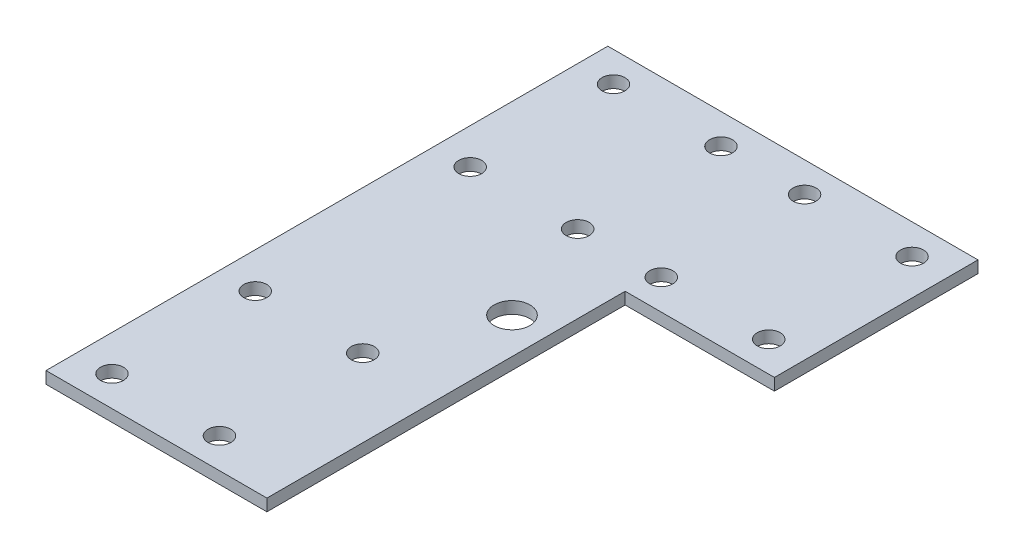
ISO-10303-21;
HEADER;
FILE_DESCRIPTION(('STEP AP214'),'2;1');
FILE_NAME('part.step','',(''),(''),'','','');
FILE_SCHEMA(('AUTOMOTIVE_DESIGN { 1 0 10303 214 1 1 1 1 }'));
ENDSEC;
DATA;
#1=APPLICATION_CONTEXT('core data for automotive mechanical design processes');
#2=APPLICATION_PROTOCOL_DEFINITION('international standard','automotive_design',2000,#1);
#3=PRODUCT_CONTEXT('',#1,'mechanical');
#4=PRODUCT('Part','Part','',(#3));
#5=PRODUCT_RELATED_PRODUCT_CATEGORY('part','',(#4));
#6=PRODUCT_DEFINITION_FORMATION('','',#4);
#7=PRODUCT_DEFINITION_CONTEXT('part definition',#1,'design');
#8=PRODUCT_DEFINITION('design','',#6,#7);
#9=PRODUCT_DEFINITION_SHAPE('','',#8);
#10=(LENGTH_UNIT() NAMED_UNIT(*) SI_UNIT(.MILLI.,.METRE.));
#11=(NAMED_UNIT(*) PLANE_ANGLE_UNIT() SI_UNIT($,.RADIAN.));
#12=(NAMED_UNIT(*) SI_UNIT($,.STERADIAN.) SOLID_ANGLE_UNIT());
#13=UNCERTAINTY_MEASURE_WITH_UNIT(LENGTH_MEASURE(1.E-05),#10,'distance_accuracy_value','');
#14=(GEOMETRIC_REPRESENTATION_CONTEXT(3) GLOBAL_UNCERTAINTY_ASSIGNED_CONTEXT((#13)) GLOBAL_UNIT_ASSIGNED_CONTEXT((#10,
#11,#12)) REPRESENTATION_CONTEXT('',''));
#15=CARTESIAN_POINT('',(0.,0.,0.));
#16=DIRECTION('',(0.,0.,1.));
#17=DIRECTION('',(1.,0.,0.));
#18=AXIS2_PLACEMENT_3D('',#15,#16,#17);
#19=CARTESIAN_POINT('',(0.,2.,0.));
#20=DIRECTION('',(0.,1.,0.));
#21=DIRECTION('',(0.,0.,1.));
#22=AXIS2_PLACEMENT_3D('',#19,#20,#21);
#23=PLANE('',#22);
#24=DIRECTION('',(0.,0.,1.));
#25=VECTOR('',#24,1.);
#26=CARTESIAN_POINT('',(-25.,2.,-60.));
#27=LINE('',#26,#25);
#28=CARTESIAN_POINT('',(-25.,2.,-60.));
#29=VERTEX_POINT('',#28);
#30=CARTESIAN_POINT('',(-25.,2.,0.));
#31=VERTEX_POINT('',#30);
#32=EDGE_CURVE('E55',#29,#31,#27,.T.);
#33=ORIENTED_EDGE('',*,*,#32,.F.);
#34=DIRECTION('',(-1.,0.,0.));
#35=VECTOR('',#34,1.);
#36=CARTESIAN_POINT('',(0.,2.,-60.));
#37=LINE('',#36,#35);
#38=CARTESIAN_POINT('',(0.,2.,-60.));
#39=VERTEX_POINT('',#38);
#40=EDGE_CURVE('E267',#39,#29,#37,.T.);
#41=ORIENTED_EDGE('',*,*,#40,.F.);
#42=DIRECTION('',(0.,0.,-1.));
#43=VECTOR('',#42,1.);
#44=CARTESIAN_POINT('',(0.,2.,0.));
#45=LINE('',#44,#43);
#46=CARTESIAN_POINT('',(0.,2.,-94.1));
#47=VERTEX_POINT('',#46);
#48=EDGE_CURVE('E86',#39,#47,#45,.T.);
#49=ORIENTED_EDGE('',*,*,#48,.T.);
#50=DIRECTION('',(-1.,0.,0.));
#51=VECTOR('',#50,1.);
#52=CARTESIAN_POINT('',(0.,2.,-94.1));
#53=LINE('',#52,#51);
#54=CARTESIAN_POINT('',(-62.,2.,-94.1));
#55=VERTEX_POINT('',#54);
#56=EDGE_CURVE('E156',#47,#55,#53,.T.);
#57=ORIENTED_EDGE('',*,*,#56,.T.);
#58=DIRECTION('',(0.,0.,1.));
#59=VECTOR('',#58,1.);
#60=CARTESIAN_POINT('',(-62.,2.,0.));
#61=LINE('',#60,#59);
#62=CARTESIAN_POINT('',(-62.,2.,0.));
#63=VERTEX_POINT('',#62);
#64=EDGE_CURVE('E64',#55,#63,#61,.T.);
#65=ORIENTED_EDGE('',*,*,#64,.T.);
#66=DIRECTION('',(1.,0.,0.));
#67=VECTOR('',#66,1.);
#68=CARTESIAN_POINT('',(0.,2.,0.));
#69=LINE('',#68,#67);
#70=EDGE_CURVE('E134',#63,#31,#69,.T.);
#71=ORIENTED_EDGE('',*,*,#70,.T.);
#72=EDGE_LOOP('',(#33,#41,#49,#57,#65,#71));
#73=FACE_BOUND('',#72,.T.);
#74=CARTESIAN_POINT('',(-31.,2.,-47.05));
#75=DIRECTION('',(0.,1.,0.));
#76=DIRECTION('',(0.,0.,1.));
#77=AXIS2_PLACEMENT_3D('',#74,#75,#76);
#78=CIRCLE('',#77,3.);
#79=CARTESIAN_POINT('',(-31.,2.,-44.05));
#80=VERTEX_POINT('',#79);
#81=EDGE_CURVE('E254',#80,#80,#78,.T.);
#82=ORIENTED_EDGE('',*,*,#81,.F.);
#83=EDGE_LOOP('',(#82));
#84=FACE_BOUND('',#83,.T.);
#85=CARTESIAN_POINT('',(-6.,2.,-65.05));
#86=DIRECTION('',(0.,1.,0.));
#87=DIRECTION('',(0.,0.,1.));
#88=AXIS2_PLACEMENT_3D('',#85,#86,#87);
#89=CIRCLE('',#88,1.925);
#90=CARTESIAN_POINT('',(-6.,2.,-63.125));
#91=VERTEX_POINT('',#90);
#92=EDGE_CURVE('E234',#91,#91,#89,.T.);
#93=ORIENTED_EDGE('',*,*,#92,.F.);
#94=EDGE_LOOP('',(#93));
#95=FACE_BOUND('',#94,.T.);
#96=CARTESIAN_POINT('',(-24.,2.,-89.05));
#97=DIRECTION('',(0.,1.,0.));
#98=DIRECTION('',(0.,0.,1.));
#99=AXIS2_PLACEMENT_3D('',#96,#97,#98);
#100=CIRCLE('',#99,1.925);
#101=CARTESIAN_POINT('',(-24.,2.,-87.125));
#102=VERTEX_POINT('',#101);
#103=EDGE_CURVE('E218',#102,#102,#100,.T.);
#104=ORIENTED_EDGE('',*,*,#103,.F.);
#105=EDGE_LOOP('',(#104));
#106=FACE_BOUND('',#105,.T.);
#107=CARTESIAN_POINT('',(-38.,2.,-5.05000000000001));
#108=DIRECTION('',(0.,1.,0.));
#109=DIRECTION('',(0.,0.,1.));
#110=AXIS2_PLACEMENT_3D('',#107,#108,#109);
#111=CIRCLE('',#110,1.925);
#112=CARTESIAN_POINT('',(-38.,2.,-3.12500000000001));
#113=VERTEX_POINT('',#112);
#114=EDGE_CURVE('E202',#113,#113,#111,.T.);
#115=ORIENTED_EDGE('',*,*,#114,.F.);
#116=EDGE_LOOP('',(#115));
#117=FACE_BOUND('',#116,.T.);
#118=CARTESIAN_POINT('',(-55.9999999999999,2.,-29.05));
#119=DIRECTION('',(0.,1.,0.));
#120=DIRECTION('',(0.,0.,1.));
#121=AXIS2_PLACEMENT_3D('',#118,#119,#120);
#122=CIRCLE('',#121,1.925);
#123=CARTESIAN_POINT('',(-55.9999999999999,2.,-27.125));
#124=VERTEX_POINT('',#123);
#125=EDGE_CURVE('E186',#124,#124,#122,.T.);
#126=ORIENTED_EDGE('',*,*,#125,.F.);
#127=EDGE_LOOP('',(#126));
#128=FACE_BOUND('',#127,.T.);
#129=CARTESIAN_POINT('',(-38.,2.,-65.05));
#130=DIRECTION('',(0.,1.,0.));
#131=DIRECTION('',(0.,0.,1.));
#132=AXIS2_PLACEMENT_3D('',#129,#130,#131);
#133=CIRCLE('',#132,1.925);
#134=CARTESIAN_POINT('',(-38.,2.,-63.125));
#135=VERTEX_POINT('',#134);
#136=EDGE_CURVE('E170',#135,#135,#133,.T.);
#137=ORIENTED_EDGE('',*,*,#136,.F.);
#138=EDGE_LOOP('',(#137));
#139=FACE_BOUND('',#138,.T.);
#140=CARTESIAN_POINT('',(-56.,2.,-89.05));
#141=DIRECTION('',(0.,1.,0.));
#142=DIRECTION('',(0.,0.,1.));
#143=AXIS2_PLACEMENT_3D('',#140,#141,#142);
#144=CIRCLE('',#143,1.925);
#145=CARTESIAN_POINT('',(-56.,2.,-87.125));
#146=VERTEX_POINT('',#145);
#147=EDGE_CURVE('E125',#146,#146,#144,.T.);
#148=ORIENTED_EDGE('',*,*,#147,.F.);
#149=EDGE_LOOP('',(#148));
#150=FACE_BOUND('',#149,.T.);
#151=CARTESIAN_POINT('',(-38.,2.,-89.05));
#152=DIRECTION('',(0.,1.,0.));
#153=DIRECTION('',(0.,0.,1.));
#154=AXIS2_PLACEMENT_3D('',#151,#152,#153);
#155=CIRCLE('',#154,1.925);
#156=CARTESIAN_POINT('',(-38.,2.,-87.125));
#157=VERTEX_POINT('',#156);
#158=EDGE_CURVE('E164',#157,#157,#155,.T.);
#159=ORIENTED_EDGE('',*,*,#158,.F.);
#160=EDGE_LOOP('',(#159));
#161=FACE_BOUND('',#160,.T.);
#162=CARTESIAN_POINT('',(-56.,2.,-65.05));
#163=DIRECTION('',(0.,1.,0.));
#164=DIRECTION('',(0.,0.,1.));
#165=AXIS2_PLACEMENT_3D('',#162,#163,#164);
#166=CIRCLE('',#165,1.925);
#167=CARTESIAN_POINT('',(-56.,2.,-63.125));
#168=VERTEX_POINT('',#167);
#169=EDGE_CURVE('E178',#168,#168,#166,.T.);
#170=ORIENTED_EDGE('',*,*,#169,.F.);
#171=EDGE_LOOP('',(#170));
#172=FACE_BOUND('',#171,.T.);
#173=CARTESIAN_POINT('',(-38.,2.,-29.05));
#174=DIRECTION('',(0.,1.,0.));
#175=DIRECTION('',(0.,0.,1.));
#176=AXIS2_PLACEMENT_3D('',#173,#174,#175);
#177=CIRCLE('',#176,1.925);
#178=CARTESIAN_POINT('',(-38.,2.,-27.125));
#179=VERTEX_POINT('',#178);
#180=EDGE_CURVE('E194',#179,#179,#177,.T.);
#181=ORIENTED_EDGE('',*,*,#180,.F.);
#182=EDGE_LOOP('',(#181));
#183=FACE_BOUND('',#182,.T.);
#184=CARTESIAN_POINT('',(-55.9999999999999,2.,-5.05000000000001));
#185=DIRECTION('',(0.,1.,0.));
#186=DIRECTION('',(0.,0.,1.));
#187=AXIS2_PLACEMENT_3D('',#184,#185,#186);
#188=CIRCLE('',#187,1.925);
#189=CARTESIAN_POINT('',(-55.9999999999999,2.,-3.12500000000001));
#190=VERTEX_POINT('',#189);
#191=EDGE_CURVE('E210',#190,#190,#188,.T.);
#192=ORIENTED_EDGE('',*,*,#191,.F.);
#193=EDGE_LOOP('',(#192));
#194=FACE_BOUND('',#193,.T.);
#195=CARTESIAN_POINT('',(-6.,2.,-89.05));
#196=DIRECTION('',(0.,1.,0.));
#197=DIRECTION('',(0.,0.,1.));
#198=AXIS2_PLACEMENT_3D('',#195,#196,#197);
#199=CIRCLE('',#198,1.925);
#200=CARTESIAN_POINT('',(-6.,2.,-87.125));
#201=VERTEX_POINT('',#200);
#202=EDGE_CURVE('E226',#201,#201,#199,.T.);
#203=ORIENTED_EDGE('',*,*,#202,.F.);
#204=EDGE_LOOP('',(#203));
#205=FACE_BOUND('',#204,.T.);
#206=CARTESIAN_POINT('',(-24.,2.,-65.05));
#207=DIRECTION('',(0.,1.,0.));
#208=DIRECTION('',(0.,0.,1.));
#209=AXIS2_PLACEMENT_3D('',#206,#207,#208);
#210=CIRCLE('',#209,1.925);
#211=CARTESIAN_POINT('',(-24.,2.,-63.125));
#212=VERTEX_POINT('',#211);
#213=EDGE_CURVE('E242',#212,#212,#210,.T.);
#214=ORIENTED_EDGE('',*,*,#213,.F.);
#215=EDGE_LOOP('',(#214));
#216=FACE_BOUND('',#215,.T.);
#217=ADVANCED_FACE('F39',(#73,#84,#95,#106,#117,#128,#139,#150,#161,#172,#183,#194,#205,#216),
#23,.T.);
#218=CARTESIAN_POINT('',(0.,0.,0.));
#219=DIRECTION('',(0.,1.,0.));
#220=DIRECTION('',(0.,0.,1.));
#221=AXIS2_PLACEMENT_3D('',#218,#219,#220);
#222=PLANE('',#221);
#223=CARTESIAN_POINT('',(-31.,0.,-47.05));
#224=DIRECTION('',(0.,1.,0.));
#225=DIRECTION('',(0.,0.,1.));
#226=AXIS2_PLACEMENT_3D('',#223,#224,#225);
#227=CIRCLE('',#226,3.);
#228=CARTESIAN_POINT('',(-31.,0.,-44.05));
#229=VERTEX_POINT('',#228);
#230=EDGE_CURVE('E250',#229,#229,#227,.T.);
#231=ORIENTED_EDGE('',*,*,#230,.T.);
#232=EDGE_LOOP('',(#231));
#233=FACE_BOUND('',#232,.T.);
#234=DIRECTION('',(-1.,0.,0.));
#235=VECTOR('',#234,1.);
#236=CARTESIAN_POINT('',(0.,0.,-60.));
#237=LINE('',#236,#235);
#238=CARTESIAN_POINT('',(0.,0.,-60.));
#239=VERTEX_POINT('',#238);
#240=CARTESIAN_POINT('',(-25.,0.,-60.));
#241=VERTEX_POINT('',#240);
#242=EDGE_CURVE('E102',#239,#241,#237,.T.);
#243=ORIENTED_EDGE('',*,*,#242,.T.);
#244=DIRECTION('',(0.,0.,1.));
#245=VECTOR('',#244,1.);
#246=CARTESIAN_POINT('',(-25.,0.,-60.));
#247=LINE('',#246,#245);
#248=CARTESIAN_POINT('',(-25.,0.,0.));
#249=VERTEX_POINT('',#248);
#250=EDGE_CURVE('E113',#241,#249,#247,.T.);
#251=ORIENTED_EDGE('',*,*,#250,.T.);
#252=DIRECTION('',(1.,0.,0.));
#253=VECTOR('',#252,1.);
#254=CARTESIAN_POINT('',(0.,0.,0.));
#255=LINE('',#254,#253);
#256=CARTESIAN_POINT('',(-62.,0.,0.));
#257=VERTEX_POINT('',#256);
#258=EDGE_CURVE('E139',#257,#249,#255,.T.);
#259=ORIENTED_EDGE('',*,*,#258,.F.);
#260=DIRECTION('',(0.,0.,1.));
#261=VECTOR('',#260,1.);
#262=CARTESIAN_POINT('',(-62.,0.,0.));
#263=LINE('',#262,#261);
#264=CARTESIAN_POINT('',(-62.,0.,-94.1));
#265=VERTEX_POINT('',#264);
#266=EDGE_CURVE('E81',#265,#257,#263,.T.);
#267=ORIENTED_EDGE('',*,*,#266,.F.);
#268=DIRECTION('',(-1.,0.,0.));
#269=VECTOR('',#268,1.);
#270=CARTESIAN_POINT('',(0.,0.,-94.1));
#271=LINE('',#270,#269);
#272=CARTESIAN_POINT('',(0.,0.,-94.1));
#273=VERTEX_POINT('',#272);
#274=EDGE_CURVE('E123',#273,#265,#271,.T.);
#275=ORIENTED_EDGE('',*,*,#274,.F.);
#276=DIRECTION('',(0.,0.,-1.));
#277=VECTOR('',#276,1.);
#278=CARTESIAN_POINT('',(0.,0.,0.));
#279=LINE('',#278,#277);
#280=EDGE_CURVE('E117',#239,#273,#279,.T.);
#281=ORIENTED_EDGE('',*,*,#280,.F.);
#282=EDGE_LOOP('',(#243,#251,#259,#267,#275,#281));
#283=FACE_BOUND('',#282,.T.);
#284=CARTESIAN_POINT('',(-56.,0.,-89.05));
#285=DIRECTION('',(0.,1.,0.));
#286=DIRECTION('',(0.,0.,1.));
#287=AXIS2_PLACEMENT_3D('',#284,#285,#286);
#288=CIRCLE('',#287,1.925);
#289=CARTESIAN_POINT('',(-56.,0.,-87.125));
#290=VERTEX_POINT('',#289);
#291=EDGE_CURVE('E131',#290,#290,#288,.T.);
#292=ORIENTED_EDGE('',*,*,#291,.T.);
#293=EDGE_LOOP('',(#292));
#294=FACE_BOUND('',#293,.T.);
#295=CARTESIAN_POINT('',(-38.,0.,-89.05));
#296=DIRECTION('',(0.,1.,0.));
#297=DIRECTION('',(0.,0.,1.));
#298=AXIS2_PLACEMENT_3D('',#295,#296,#297);
#299=CIRCLE('',#298,1.925);
#300=CARTESIAN_POINT('',(-38.,0.,-87.125));
#301=VERTEX_POINT('',#300);
#302=EDGE_CURVE('E166',#301,#301,#299,.T.);
#303=ORIENTED_EDGE('',*,*,#302,.T.);
#304=EDGE_LOOP('',(#303));
#305=FACE_BOUND('',#304,.T.);
#306=CARTESIAN_POINT('',(-38.,0.,-65.05));
#307=DIRECTION('',(0.,1.,0.));
#308=DIRECTION('',(0.,0.,1.));
#309=AXIS2_PLACEMENT_3D('',#306,#307,#308);
#310=CIRCLE('',#309,1.925);
#311=CARTESIAN_POINT('',(-38.,0.,-63.125));
#312=VERTEX_POINT('',#311);
#313=EDGE_CURVE('E174',#312,#312,#310,.T.);
#314=ORIENTED_EDGE('',*,*,#313,.T.);
#315=EDGE_LOOP('',(#314));
#316=FACE_BOUND('',#315,.T.);
#317=CARTESIAN_POINT('',(-56.,0.,-65.05));
#318=DIRECTION('',(0.,1.,0.));
#319=DIRECTION('',(0.,0.,1.));
#320=AXIS2_PLACEMENT_3D('',#317,#318,#319);
#321=CIRCLE('',#320,1.925);
#322=CARTESIAN_POINT('',(-56.,0.,-63.125));
#323=VERTEX_POINT('',#322);
#324=EDGE_CURVE('E182',#323,#323,#321,.T.);
#325=ORIENTED_EDGE('',*,*,#324,.T.);
#326=EDGE_LOOP('',(#325));
#327=FACE_BOUND('',#326,.T.);
#328=CARTESIAN_POINT('',(-55.9999999999999,0.,-29.05));
#329=DIRECTION('',(0.,1.,0.));
#330=DIRECTION('',(0.,0.,1.));
#331=AXIS2_PLACEMENT_3D('',#328,#329,#330);
#332=CIRCLE('',#331,1.925);
#333=CARTESIAN_POINT('',(-55.9999999999999,0.,-27.125));
#334=VERTEX_POINT('',#333);
#335=EDGE_CURVE('E190',#334,#334,#332,.T.);
#336=ORIENTED_EDGE('',*,*,#335,.T.);
#337=EDGE_LOOP('',(#336));
#338=FACE_BOUND('',#337,.T.);
#339=CARTESIAN_POINT('',(-38.,0.,-29.05));
#340=DIRECTION('',(0.,1.,0.));
#341=DIRECTION('',(0.,0.,1.));
#342=AXIS2_PLACEMENT_3D('',#339,#340,#341);
#343=CIRCLE('',#342,1.925);
#344=CARTESIAN_POINT('',(-38.,0.,-27.125));
#345=VERTEX_POINT('',#344);
#346=EDGE_CURVE('E198',#345,#345,#343,.T.);
#347=ORIENTED_EDGE('',*,*,#346,.T.);
#348=EDGE_LOOP('',(#347));
#349=FACE_BOUND('',#348,.T.);
#350=CARTESIAN_POINT('',(-38.,0.,-5.05000000000001));
#351=DIRECTION('',(0.,1.,0.));
#352=DIRECTION('',(0.,0.,1.));
#353=AXIS2_PLACEMENT_3D('',#350,#351,#352);
#354=CIRCLE('',#353,1.925);
#355=CARTESIAN_POINT('',(-38.,0.,-3.12500000000001));
#356=VERTEX_POINT('',#355);
#357=EDGE_CURVE('E206',#356,#356,#354,.T.);
#358=ORIENTED_EDGE('',*,*,#357,.T.);
#359=EDGE_LOOP('',(#358));
#360=FACE_BOUND('',#359,.T.);
#361=CARTESIAN_POINT('',(-55.9999999999999,0.,-5.05000000000001));
#362=DIRECTION('',(0.,1.,0.));
#363=DIRECTION('',(0.,0.,1.));
#364=AXIS2_PLACEMENT_3D('',#361,#362,#363);
#365=CIRCLE('',#364,1.925);
#366=CARTESIAN_POINT('',(-55.9999999999999,0.,-3.12500000000001));
#367=VERTEX_POINT('',#366);
#368=EDGE_CURVE('E214',#367,#367,#365,.T.);
#369=ORIENTED_EDGE('',*,*,#368,.T.);
#370=EDGE_LOOP('',(#369));
#371=FACE_BOUND('',#370,.T.);
#372=CARTESIAN_POINT('',(-24.,0.,-89.05));
#373=DIRECTION('',(0.,1.,0.));
#374=DIRECTION('',(0.,0.,1.));
#375=AXIS2_PLACEMENT_3D('',#372,#373,#374);
#376=CIRCLE('',#375,1.925);
#377=CARTESIAN_POINT('',(-24.,0.,-87.125));
#378=VERTEX_POINT('',#377);
#379=EDGE_CURVE('E222',#378,#378,#376,.T.);
#380=ORIENTED_EDGE('',*,*,#379,.T.);
#381=EDGE_LOOP('',(#380));
#382=FACE_BOUND('',#381,.T.);
#383=CARTESIAN_POINT('',(-6.,0.,-89.05));
#384=DIRECTION('',(0.,1.,0.));
#385=DIRECTION('',(0.,0.,1.));
#386=AXIS2_PLACEMENT_3D('',#383,#384,#385);
#387=CIRCLE('',#386,1.925);
#388=CARTESIAN_POINT('',(-6.,0.,-87.125));
#389=VERTEX_POINT('',#388);
#390=EDGE_CURVE('E230',#389,#389,#387,.T.);
#391=ORIENTED_EDGE('',*,*,#390,.T.);
#392=EDGE_LOOP('',(#391));
#393=FACE_BOUND('',#392,.T.);
#394=CARTESIAN_POINT('',(-6.,0.,-65.05));
#395=DIRECTION('',(0.,1.,0.));
#396=DIRECTION('',(0.,0.,1.));
#397=AXIS2_PLACEMENT_3D('',#394,#395,#396);
#398=CIRCLE('',#397,1.925);
#399=CARTESIAN_POINT('',(-6.,0.,-63.125));
#400=VERTEX_POINT('',#399);
#401=EDGE_CURVE('E238',#400,#400,#398,.T.);
#402=ORIENTED_EDGE('',*,*,#401,.T.);
#403=EDGE_LOOP('',(#402));
#404=FACE_BOUND('',#403,.T.);
#405=CARTESIAN_POINT('',(-24.,0.,-65.05));
#406=DIRECTION('',(0.,1.,0.));
#407=DIRECTION('',(0.,0.,1.));
#408=AXIS2_PLACEMENT_3D('',#405,#406,#407);
#409=CIRCLE('',#408,1.925);
#410=CARTESIAN_POINT('',(-24.,0.,-63.125));
#411=VERTEX_POINT('',#410);
#412=EDGE_CURVE('E246',#411,#411,#409,.T.);
#413=ORIENTED_EDGE('',*,*,#412,.T.);
#414=EDGE_LOOP('',(#413));
#415=FACE_BOUND('',#414,.T.);
#416=ADVANCED_FACE('F121',(#233,#283,#294,#305,#316,#327,#338,#349,#360,#371,#382,#393,#404,
#415),#222,.F.);
#417=CARTESIAN_POINT('',(0.,2.,0.));
#418=DIRECTION('',(-1.,0.,0.));
#419=DIRECTION('',(0.,0.,1.));
#420=AXIS2_PLACEMENT_3D('',#417,#418,#419);
#421=PLANE('',#420);
#422=ORIENTED_EDGE('',*,*,#48,.F.);
#423=DIRECTION('',(0.,1.,0.));
#424=VECTOR('',#423,1.);
#425=CARTESIAN_POINT('',(0.,0.,-60.));
#426=LINE('',#425,#424);
#427=EDGE_CURVE('E106',#239,#39,#426,.T.);
#428=ORIENTED_EDGE('',*,*,#427,.F.);
#429=ORIENTED_EDGE('',*,*,#280,.T.);
#430=DIRECTION('',(0.,-1.,0.));
#431=VECTOR('',#430,1.);
#432=CARTESIAN_POINT('',(0.,2.,-94.1));
#433=LINE('',#432,#431);
#434=EDGE_CURVE('E11',#47,#273,#433,.T.);
#435=ORIENTED_EDGE('',*,*,#434,.F.);
#436=EDGE_LOOP('',(#422,#428,#429,#435));
#437=FACE_BOUND('',#436,.T.);
#438=ADVANCED_FACE('F41',(#437),#421,.F.);
#439=CARTESIAN_POINT('',(0.,2.,-94.1));
#440=DIRECTION('',(0.,0.,1.));
#441=DIRECTION('',(1.,0.,0.));
#442=AXIS2_PLACEMENT_3D('',#439,#440,#441);
#443=PLANE('',#442);
#444=ORIENTED_EDGE('',*,*,#274,.T.);
#445=DIRECTION('',(0.,-1.,0.));
#446=VECTOR('',#445,1.);
#447=CARTESIAN_POINT('',(-62.,2.,-94.1));
#448=LINE('',#447,#446);
#449=EDGE_CURVE('E48',#55,#265,#448,.T.);
#450=ORIENTED_EDGE('',*,*,#449,.F.);
#451=ORIENTED_EDGE('',*,*,#56,.F.);
#452=ORIENTED_EDGE('',*,*,#434,.T.);
#453=EDGE_LOOP('',(#444,#450,#451,#452));
#454=FACE_BOUND('',#453,.T.);
#455=ADVANCED_FACE('F314',(#454),#443,.F.);
#456=CARTESIAN_POINT('',(-62.,2.,0.));
#457=DIRECTION('',(1.,0.,0.));
#458=DIRECTION('',(0.,0.,-1.));
#459=AXIS2_PLACEMENT_3D('',#456,#457,#458);
#460=PLANE('',#459);
#461=ORIENTED_EDGE('',*,*,#266,.T.);
#462=DIRECTION('',(0.,-1.,0.));
#463=VECTOR('',#462,1.);
#464=CARTESIAN_POINT('',(-62.,2.,0.));
#465=LINE('',#464,#463);
#466=EDGE_CURVE('E143',#63,#257,#465,.T.);
#467=ORIENTED_EDGE('',*,*,#466,.F.);
#468=ORIENTED_EDGE('',*,*,#64,.F.);
#469=ORIENTED_EDGE('',*,*,#449,.T.);
#470=EDGE_LOOP('',(#461,#467,#468,#469));
#471=FACE_BOUND('',#470,.T.);
#472=ADVANCED_FACE('F147',(#471),#460,.F.);
#473=CARTESIAN_POINT('',(0.,2.,0.));
#474=DIRECTION('',(0.,0.,-1.));
#475=DIRECTION('',(-1.,0.,0.));
#476=AXIS2_PLACEMENT_3D('',#473,#474,#475);
#477=PLANE('',#476);
#478=ORIENTED_EDGE('',*,*,#258,.T.);
#479=DIRECTION('',(0.,1.,0.));
#480=VECTOR('',#479,1.);
#481=CARTESIAN_POINT('',(-25.,0.,0.));
#482=LINE('',#481,#480);
#483=EDGE_CURVE('E153',#249,#31,#482,.T.);
#484=ORIENTED_EDGE('',*,*,#483,.T.);
#485=ORIENTED_EDGE('',*,*,#70,.F.);
#486=ORIENTED_EDGE('',*,*,#466,.T.);
#487=EDGE_LOOP('',(#478,#484,#485,#486));
#488=FACE_BOUND('',#487,.T.);
#489=ADVANCED_FACE('F151',(#488),#477,.F.);
#490=CARTESIAN_POINT('',(-56.,2.,-89.05));
#491=DIRECTION('',(0.,-1.,0.));
#492=DIRECTION('',(0.,0.,-1.));
#493=AXIS2_PLACEMENT_3D('',#490,#491,#492);
#494=CYLINDRICAL_SURFACE('',#493,1.925);
#495=ORIENTED_EDGE('',*,*,#147,.T.);
#496=EDGE_LOOP('',(#495));
#497=FACE_BOUND('',#496,.T.);
#498=ORIENTED_EDGE('',*,*,#291,.F.);
#499=EDGE_LOOP('',(#498));
#500=FACE_BOUND('',#499,.T.);
#501=ADVANCED_FACE('F319',(#497,#500),#494,.F.);
#502=CARTESIAN_POINT('',(-38.,2.,-89.05));
#503=DIRECTION('',(0.,-1.,0.));
#504=DIRECTION('',(0.,0.,-1.));
#505=AXIS2_PLACEMENT_3D('',#502,#503,#504);
#506=CYLINDRICAL_SURFACE('',#505,1.925);
#507=ORIENTED_EDGE('',*,*,#158,.T.);
#508=EDGE_LOOP('',(#507));
#509=FACE_BOUND('',#508,.T.);
#510=ORIENTED_EDGE('',*,*,#302,.F.);
#511=EDGE_LOOP('',(#510));
#512=FACE_BOUND('',#511,.T.);
#513=ADVANCED_FACE('F341',(#509,#512),#506,.F.);
#514=CARTESIAN_POINT('',(-38.,2.,-65.05));
#515=DIRECTION('',(0.,-1.,0.));
#516=DIRECTION('',(0.,0.,-1.));
#517=AXIS2_PLACEMENT_3D('',#514,#515,#516);
#518=CYLINDRICAL_SURFACE('',#517,1.925);
#519=ORIENTED_EDGE('',*,*,#136,.T.);
#520=EDGE_LOOP('',(#519));
#521=FACE_BOUND('',#520,.T.);
#522=ORIENTED_EDGE('',*,*,#313,.F.);
#523=EDGE_LOOP('',(#522));
#524=FACE_BOUND('',#523,.T.);
#525=ADVANCED_FACE('F348',(#521,#524),#518,.F.);
#526=CARTESIAN_POINT('',(-56.,2.,-65.05));
#527=DIRECTION('',(0.,-1.,0.));
#528=DIRECTION('',(0.,0.,-1.));
#529=AXIS2_PLACEMENT_3D('',#526,#527,#528);
#530=CYLINDRICAL_SURFACE('',#529,1.925);
#531=ORIENTED_EDGE('',*,*,#169,.T.);
#532=EDGE_LOOP('',(#531));
#533=FACE_BOUND('',#532,.T.);
#534=ORIENTED_EDGE('',*,*,#324,.F.);
#535=EDGE_LOOP('',(#534));
#536=FACE_BOUND('',#535,.T.);
#537=ADVANCED_FACE('F356',(#533,#536),#530,.F.);
#538=CARTESIAN_POINT('',(-55.9999999999999,2.,-29.05));
#539=DIRECTION('',(0.,-1.,0.));
#540=DIRECTION('',(0.,0.,-1.));
#541=AXIS2_PLACEMENT_3D('',#538,#539,#540);
#542=CYLINDRICAL_SURFACE('',#541,1.925);
#543=ORIENTED_EDGE('',*,*,#125,.T.);
#544=EDGE_LOOP('',(#543));
#545=FACE_BOUND('',#544,.T.);
#546=ORIENTED_EDGE('',*,*,#335,.F.);
#547=EDGE_LOOP('',(#546));
#548=FACE_BOUND('',#547,.T.);
#549=ADVANCED_FACE('F364',(#545,#548),#542,.F.);
#550=CARTESIAN_POINT('',(-38.,2.,-29.05));
#551=DIRECTION('',(0.,-1.,0.));
#552=DIRECTION('',(0.,0.,-1.));
#553=AXIS2_PLACEMENT_3D('',#550,#551,#552);
#554=CYLINDRICAL_SURFACE('',#553,1.925);
#555=ORIENTED_EDGE('',*,*,#180,.T.);
#556=EDGE_LOOP('',(#555));
#557=FACE_BOUND('',#556,.T.);
#558=ORIENTED_EDGE('',*,*,#346,.F.);
#559=EDGE_LOOP('',(#558));
#560=FACE_BOUND('',#559,.T.);
#561=ADVANCED_FACE('F372',(#557,#560),#554,.F.);
#562=CARTESIAN_POINT('',(-38.,2.,-5.05000000000001));
#563=DIRECTION('',(0.,-1.,0.));
#564=DIRECTION('',(0.,0.,-1.));
#565=AXIS2_PLACEMENT_3D('',#562,#563,#564);
#566=CYLINDRICAL_SURFACE('',#565,1.925);
#567=ORIENTED_EDGE('',*,*,#114,.T.);
#568=EDGE_LOOP('',(#567));
#569=FACE_BOUND('',#568,.T.);
#570=ORIENTED_EDGE('',*,*,#357,.F.);
#571=EDGE_LOOP('',(#570));
#572=FACE_BOUND('',#571,.T.);
#573=ADVANCED_FACE('F380',(#569,#572),#566,.F.);
#574=CARTESIAN_POINT('',(-55.9999999999999,2.,-5.05000000000001));
#575=DIRECTION('',(0.,-1.,0.));
#576=DIRECTION('',(0.,0.,-1.));
#577=AXIS2_PLACEMENT_3D('',#574,#575,#576);
#578=CYLINDRICAL_SURFACE('',#577,1.925);
#579=ORIENTED_EDGE('',*,*,#191,.T.);
#580=EDGE_LOOP('',(#579));
#581=FACE_BOUND('',#580,.T.);
#582=ORIENTED_EDGE('',*,*,#368,.F.);
#583=EDGE_LOOP('',(#582));
#584=FACE_BOUND('',#583,.T.);
#585=ADVANCED_FACE('F388',(#581,#584),#578,.F.);
#586=CARTESIAN_POINT('',(-24.,2.,-89.05));
#587=DIRECTION('',(0.,-1.,0.));
#588=DIRECTION('',(0.,0.,-1.));
#589=AXIS2_PLACEMENT_3D('',#586,#587,#588);
#590=CYLINDRICAL_SURFACE('',#589,1.925);
#591=ORIENTED_EDGE('',*,*,#103,.T.);
#592=EDGE_LOOP('',(#591));
#593=FACE_BOUND('',#592,.T.);
#594=ORIENTED_EDGE('',*,*,#379,.F.);
#595=EDGE_LOOP('',(#594));
#596=FACE_BOUND('',#595,.T.);
#597=ADVANCED_FACE('F396',(#593,#596),#590,.F.);
#598=CARTESIAN_POINT('',(-6.,2.,-89.05));
#599=DIRECTION('',(0.,-1.,0.));
#600=DIRECTION('',(0.,0.,-1.));
#601=AXIS2_PLACEMENT_3D('',#598,#599,#600);
#602=CYLINDRICAL_SURFACE('',#601,1.925);
#603=ORIENTED_EDGE('',*,*,#202,.T.);
#604=EDGE_LOOP('',(#603));
#605=FACE_BOUND('',#604,.T.);
#606=ORIENTED_EDGE('',*,*,#390,.F.);
#607=EDGE_LOOP('',(#606));
#608=FACE_BOUND('',#607,.T.);
#609=ADVANCED_FACE('F404',(#605,#608),#602,.F.);
#610=CARTESIAN_POINT('',(-6.,2.,-65.05));
#611=DIRECTION('',(0.,-1.,0.));
#612=DIRECTION('',(0.,0.,-1.));
#613=AXIS2_PLACEMENT_3D('',#610,#611,#612);
#614=CYLINDRICAL_SURFACE('',#613,1.925);
#615=ORIENTED_EDGE('',*,*,#92,.T.);
#616=EDGE_LOOP('',(#615));
#617=FACE_BOUND('',#616,.T.);
#618=ORIENTED_EDGE('',*,*,#401,.F.);
#619=EDGE_LOOP('',(#618));
#620=FACE_BOUND('',#619,.T.);
#621=ADVANCED_FACE('F304',(#617,#620),#614,.F.);
#622=CARTESIAN_POINT('',(-24.,2.,-65.05));
#623=DIRECTION('',(0.,-1.,0.));
#624=DIRECTION('',(0.,0.,-1.));
#625=AXIS2_PLACEMENT_3D('',#622,#623,#624);
#626=CYLINDRICAL_SURFACE('',#625,1.925);
#627=ORIENTED_EDGE('',*,*,#213,.T.);
#628=EDGE_LOOP('',(#627));
#629=FACE_BOUND('',#628,.T.);
#630=ORIENTED_EDGE('',*,*,#412,.F.);
#631=EDGE_LOOP('',(#630));
#632=FACE_BOUND('',#631,.T.);
#633=ADVANCED_FACE('F300',(#629,#632),#626,.F.);
#634=CARTESIAN_POINT('',(-31.,0.,-47.05));
#635=DIRECTION('',(0.,1.,0.));
#636=DIRECTION('',(0.,0.,1.));
#637=AXIS2_PLACEMENT_3D('',#634,#635,#636);
#638=CYLINDRICAL_SURFACE('',#637,3.);
#639=ORIENTED_EDGE('',*,*,#230,.F.);
#640=EDGE_LOOP('',(#639));
#641=FACE_BOUND('',#640,.T.);
#642=ORIENTED_EDGE('',*,*,#81,.T.);
#643=EDGE_LOOP('',(#642));
#644=FACE_BOUND('',#643,.T.);
#645=ADVANCED_FACE('F303',(#641,#644),#638,.F.);
#646=CARTESIAN_POINT('',(-25.,0.,-60.));
#647=DIRECTION('',(-1.,0.,0.));
#648=DIRECTION('',(0.,0.,1.));
#649=AXIS2_PLACEMENT_3D('',#646,#647,#648);
#650=PLANE('',#649);
#651=ORIENTED_EDGE('',*,*,#32,.T.);
#652=ORIENTED_EDGE('',*,*,#483,.F.);
#653=ORIENTED_EDGE('',*,*,#250,.F.);
#654=DIRECTION('',(0.,1.,0.));
#655=VECTOR('',#654,1.);
#656=CARTESIAN_POINT('',(-25.,0.,-60.));
#657=LINE('',#656,#655);
#658=EDGE_CURVE('E107',#241,#29,#657,.T.);
#659=ORIENTED_EDGE('',*,*,#658,.T.);
#660=EDGE_LOOP('',(#651,#652,#653,#659));
#661=FACE_BOUND('',#660,.T.);
#662=ADVANCED_FACE('F430',(#661),#650,.F.);
#663=CARTESIAN_POINT('',(0.,0.,-60.));
#664=DIRECTION('',(0.,0.,-1.));
#665=DIRECTION('',(-1.,0.,0.));
#666=AXIS2_PLACEMENT_3D('',#663,#664,#665);
#667=PLANE('',#666);
#668=ORIENTED_EDGE('',*,*,#40,.T.);
#669=ORIENTED_EDGE('',*,*,#658,.F.);
#670=ORIENTED_EDGE('',*,*,#242,.F.);
#671=ORIENTED_EDGE('',*,*,#427,.T.);
#672=EDGE_LOOP('',(#668,#669,#670,#671));
#673=FACE_BOUND('',#672,.T.);
#674=ADVANCED_FACE('F105',(#673),#667,.F.);
#675=CLOSED_SHELL('',(#217,#416,#438,#455,#472,#489,#501,#513,#525,#537,#549,#561,#573,#585,
#597,#609,#621,#633,#645,#662,#674));
#676=MANIFOLD_SOLID_BREP('B2',#675);
#677=ADVANCED_BREP_SHAPE_REPRESENTATION('',(#18,#676),#14);
#678=SHAPE_DEFINITION_REPRESENTATION(#9,#677);
ENDSEC;
END-ISO-10303-21;
